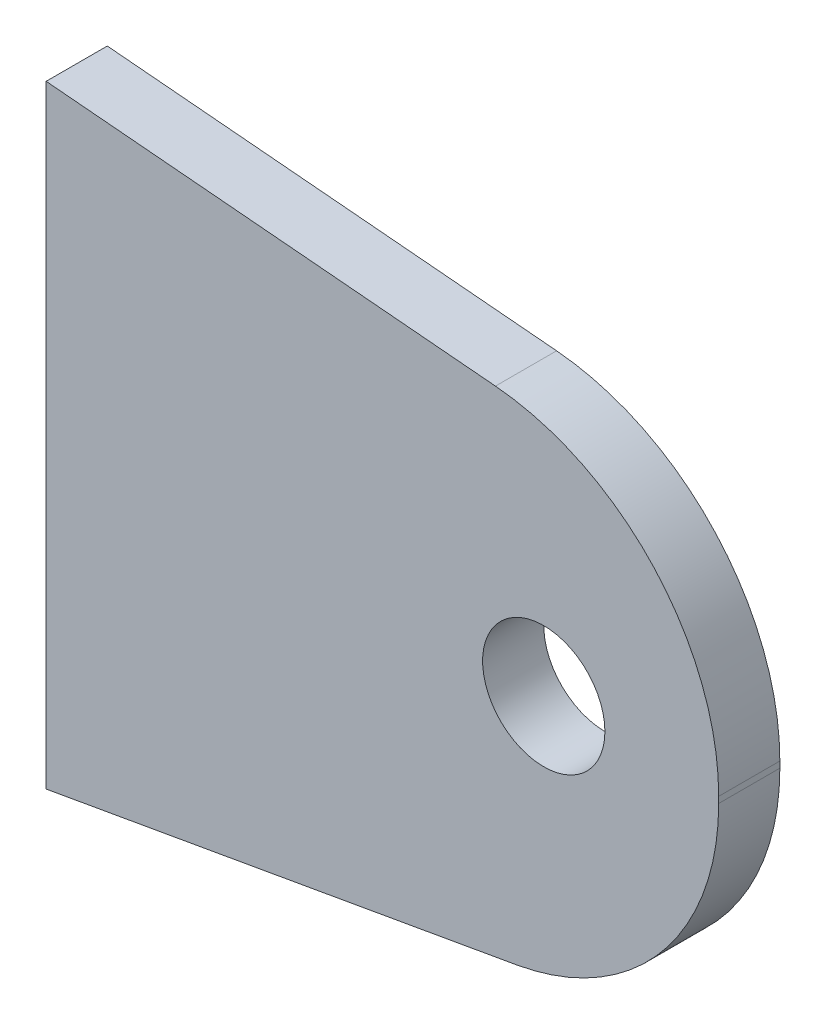
ISO-10303-21;
HEADER;
FILE_DESCRIPTION(('STEP AP214'),'2;1');
FILE_NAME('part.step','',(''),(''),'','','');
FILE_SCHEMA(('AUTOMOTIVE_DESIGN { 1 0 10303 214 1 1 1 1 }'));
ENDSEC;
DATA;
#1=APPLICATION_CONTEXT('core data for automotive mechanical design processes');
#2=APPLICATION_PROTOCOL_DEFINITION('international standard','automotive_design',2000,#1);
#3=PRODUCT_CONTEXT('',#1,'mechanical');
#4=PRODUCT('Part','Part','',(#3));
#5=PRODUCT_RELATED_PRODUCT_CATEGORY('part','',(#4));
#6=PRODUCT_DEFINITION_FORMATION('','',#4);
#7=PRODUCT_DEFINITION_CONTEXT('part definition',#1,'design');
#8=PRODUCT_DEFINITION('design','',#6,#7);
#9=PRODUCT_DEFINITION_SHAPE('','',#8);
#10=(LENGTH_UNIT() NAMED_UNIT(*) SI_UNIT(.MILLI.,.METRE.));
#11=(NAMED_UNIT(*) PLANE_ANGLE_UNIT() SI_UNIT($,.RADIAN.));
#12=(NAMED_UNIT(*) SI_UNIT($,.STERADIAN.) SOLID_ANGLE_UNIT());
#13=UNCERTAINTY_MEASURE_WITH_UNIT(LENGTH_MEASURE(1.E-05),#10,'distance_accuracy_value','');
#14=(GEOMETRIC_REPRESENTATION_CONTEXT(3) GLOBAL_UNCERTAINTY_ASSIGNED_CONTEXT((#13)) GLOBAL_UNIT_ASSIGNED_CONTEXT((#10,
#11,#12)) REPRESENTATION_CONTEXT('',''));
#15=CARTESIAN_POINT('',(0.,0.,0.));
#16=DIRECTION('',(0.,0.,1.));
#17=DIRECTION('',(1.,0.,0.));
#18=AXIS2_PLACEMENT_3D('',#15,#16,#17);
#19=CARTESIAN_POINT('',(-29.2805766428955,20.7610868287197,3.175));
#20=DIRECTION('',(1.,0.,0.));
#21=DIRECTION('',(0.,0.,-1.));
#22=AXIS2_PLACEMENT_3D('',#19,#20,#21);
#23=PLANE('',#22);
#24=DIRECTION('',(0.,-1.,0.));
#25=VECTOR('',#24,1.);
#26=CARTESIAN_POINT('',(-29.2805766428955,20.7610868287197,0.));
#27=LINE('',#26,#25);
#28=CARTESIAN_POINT('',(-29.2805766428955,20.7610868287197,0.));
#29=VERTEX_POINT('',#28);
#30=CARTESIAN_POINT('',(-29.2805766428955,-11.0681611712803,0.));
#31=VERTEX_POINT('',#30);
#32=EDGE_CURVE('E104',#29,#31,#27,.T.);
#33=ORIENTED_EDGE('',*,*,#32,.T.);
#34=DIRECTION('',(0.,0.,-1.));
#35=VECTOR('',#34,1.);
#36=CARTESIAN_POINT('',(-29.2805766428955,-11.0681611712803,3.175));
#37=LINE('',#36,#35);
#38=CARTESIAN_POINT('',(-29.2805766428955,-11.0681611712803,3.175));
#39=VERTEX_POINT('',#38);
#40=EDGE_CURVE('E92',#39,#31,#37,.T.);
#41=ORIENTED_EDGE('',*,*,#40,.F.);
#42=DIRECTION('',(0.,-1.,0.));
#43=VECTOR('',#42,1.);
#44=CARTESIAN_POINT('',(-29.2805766428955,20.7610868287197,3.175));
#45=LINE('',#44,#43);
#46=CARTESIAN_POINT('',(-29.2805766428955,20.7610868287197,3.175));
#47=VERTEX_POINT('',#46);
#48=EDGE_CURVE('E102',#47,#39,#45,.T.);
#49=ORIENTED_EDGE('',*,*,#48,.F.);
#50=DIRECTION('',(0.,0.,-1.));
#51=VECTOR('',#50,1.);
#52=CARTESIAN_POINT('',(-29.2805766428955,20.7610868287197,3.175));
#53=LINE('',#52,#51);
#54=EDGE_CURVE('E112',#47,#29,#53,.T.);
#55=ORIENTED_EDGE('',*,*,#54,.T.);
#56=EDGE_LOOP('',(#33,#41,#49,#55));
#57=FACE_BOUND('',#56,.T.);
#58=ADVANCED_FACE('F39',(#57),#23,.F.);
#59=CARTESIAN_POINT('',(0.,0.,3.175));
#60=DIRECTION('',(0.,0.,1.));
#61=DIRECTION('',(1.,0.,0.));
#62=AXIS2_PLACEMENT_3D('',#59,#60,#61);
#63=PLANE('',#62);
#64=DIRECTION('',(0.,-1.,0.));
#65=VECTOR('',#64,1.);
#66=CARTESIAN_POINT('',(5.6444233571045,0.,3.175));
#67=LINE('',#66,#65);
#68=CARTESIAN_POINT('',(5.6444233571045,6.06813934505543,3.175));
#69=VERTEX_POINT('',#68);
#70=CARTESIAN_POINT('',(5.6444233571045,5.74662394591438,3.175));
#71=VERTEX_POINT('',#70);
#72=EDGE_CURVE('E95',#69,#71,#67,.T.);
#73=ORIENTED_EDGE('',*,*,#72,.F.);
#74=CARTESIAN_POINT('',(-7.05557664289549,6.06813934505543,3.175));
#75=DIRECTION('',(0.,0.,1.));
#76=DIRECTION('',(1.,0.,0.));
#77=AXIS2_PLACEMENT_3D('',#74,#75,#76);
#78=CIRCLE('',#77,12.7);
#79=CARTESIAN_POINT('',(-5.94869871000019,18.7198120108206,3.175));
#80=VERTEX_POINT('',#79);
#81=EDGE_CURVE('E47',#69,#80,#78,.T.);
#82=ORIENTED_EDGE('',*,*,#81,.T.);
#83=DIRECTION('',(-0.996194698091745,0.0871557427476617,0.));
#84=VECTOR('',#83,1.);
#85=CARTESIAN_POINT('',(1.58014357094418,18.0611236617633,3.175));
#86=LINE('',#85,#84);
#87=EDGE_CURVE('E106',#80,#47,#86,.T.);
#88=ORIENTED_EDGE('',*,*,#87,.T.);
#89=ORIENTED_EDGE('',*,*,#48,.T.);
#90=DIRECTION('',(0.984807753012208,0.173648177666934,0.));
#91=VECTOR('',#90,1.);
#92=CARTESIAN_POINT('',(1.00984961547126,-5.72714176476997,3.175));
#93=LINE('',#92,#91);
#94=CARTESIAN_POINT('',(-4.85024478652543,-6.76043451734065,3.175));
#95=VERTEX_POINT('',#94);
#96=EDGE_CURVE('E89',#39,#95,#93,.T.);
#97=ORIENTED_EDGE('',*,*,#96,.T.);
#98=CARTESIAN_POINT('',(-7.05557664289549,5.74662394591439,3.175));
#99=DIRECTION('',(0.,0.,1.));
#100=DIRECTION('',(1.,0.,0.));
#101=AXIS2_PLACEMENT_3D('',#98,#99,#100);
#102=CIRCLE('',#101,12.7);
#103=EDGE_CURVE('E59',#95,#71,#102,.T.);
#104=ORIENTED_EDGE('',*,*,#103,.T.);
#105=EDGE_LOOP('',(#73,#82,#88,#89,#97,#104));
#106=FACE_BOUND('',#105,.T.);
#107=CARTESIAN_POINT('',(-3.43988664289549,6.02883282871969,3.175));
#108=DIRECTION('',(0.,0.,1.));
#109=DIRECTION('',(1.,0.,0.));
#110=AXIS2_PLACEMENT_3D('',#107,#108,#109);
#111=CIRCLE('',#110,3.17499999999999);
#112=CARTESIAN_POINT('',(-0.264886642895501,6.02883282871969,3.175));
#113=VERTEX_POINT('',#112);
#114=EDGE_CURVE('E105',#113,#113,#111,.T.);
#115=ORIENTED_EDGE('',*,*,#114,.F.);
#116=EDGE_LOOP('',(#115));
#117=FACE_BOUND('',#116,.T.);
#118=ADVANCED_FACE('F108',(#106,#117),#63,.T.);
#119=CARTESIAN_POINT('',(0.,0.,0.));
#120=DIRECTION('',(0.,0.,1.));
#121=DIRECTION('',(1.,0.,0.));
#122=AXIS2_PLACEMENT_3D('',#119,#120,#121);
#123=PLANE('',#122);
#124=CARTESIAN_POINT('',(-3.43988664289549,6.02883282871969,0.));
#125=DIRECTION('',(0.,0.,1.));
#126=DIRECTION('',(1.,0.,0.));
#127=AXIS2_PLACEMENT_3D('',#124,#125,#126);
#128=CIRCLE('',#127,3.17499999999999);
#129=CARTESIAN_POINT('',(-0.264886642895497,6.02883282871969,0.));
#130=VERTEX_POINT('',#129);
#131=EDGE_CURVE('E116',#130,#130,#128,.T.);
#132=ORIENTED_EDGE('',*,*,#131,.T.);
#133=EDGE_LOOP('',(#132));
#134=FACE_BOUND('',#133,.T.);
#135=DIRECTION('',(-0.996194698091745,0.0871557427476617,0.));
#136=VECTOR('',#135,1.);
#137=CARTESIAN_POINT('',(1.58014357094418,18.0611236617633,0.));
#138=LINE('',#137,#136);
#139=CARTESIAN_POINT('',(-5.94869871000019,18.7198120108206,0.));
#140=VERTEX_POINT('',#139);
#141=EDGE_CURVE('E96',#140,#29,#138,.T.);
#142=ORIENTED_EDGE('',*,*,#141,.F.);
#143=CARTESIAN_POINT('',(-7.05557664289549,6.06813934505543,0.));
#144=DIRECTION('',(0.,0.,1.));
#145=DIRECTION('',(1.,0.,0.));
#146=AXIS2_PLACEMENT_3D('',#143,#144,#145);
#147=CIRCLE('',#146,12.7);
#148=CARTESIAN_POINT('',(5.6444233571045,6.06813934505543,0.));
#149=VERTEX_POINT('',#148);
#150=EDGE_CURVE('E125',#140,#149,#147,.F.);
#151=ORIENTED_EDGE('',*,*,#150,.T.);
#152=DIRECTION('',(0.,-1.,0.));
#153=VECTOR('',#152,1.);
#154=CARTESIAN_POINT('',(5.6444233571045,0.,0.));
#155=LINE('',#154,#153);
#156=CARTESIAN_POINT('',(5.6444233571045,5.74662394591438,0.));
#157=VERTEX_POINT('',#156);
#158=EDGE_CURVE('E145',#149,#157,#155,.T.);
#159=ORIENTED_EDGE('',*,*,#158,.T.);
#160=CARTESIAN_POINT('',(-7.05557664289549,5.74662394591439,0.));
#161=DIRECTION('',(0.,0.,1.));
#162=DIRECTION('',(1.,0.,0.));
#163=AXIS2_PLACEMENT_3D('',#160,#161,#162);
#164=CIRCLE('',#163,12.7);
#165=CARTESIAN_POINT('',(-4.85024478652543,-6.76043451734065,0.));
#166=VERTEX_POINT('',#165);
#167=EDGE_CURVE('E123',#157,#166,#164,.F.);
#168=ORIENTED_EDGE('',*,*,#167,.T.);
#169=DIRECTION('',(0.984807753012208,0.173648177666934,0.));
#170=VECTOR('',#169,1.);
#171=CARTESIAN_POINT('',(1.00984961547126,-5.72714176476997,0.));
#172=LINE('',#171,#170);
#173=EDGE_CURVE('E149',#31,#166,#172,.T.);
#174=ORIENTED_EDGE('',*,*,#173,.F.);
#175=ORIENTED_EDGE('',*,*,#32,.F.);
#176=EDGE_LOOP('',(#142,#151,#159,#168,#174,#175));
#177=FACE_BOUND('',#176,.T.);
#178=ADVANCED_FACE('F144',(#134,#177),#123,.F.);
#179=CARTESIAN_POINT('',(-3.43988664289549,6.02883282871969,3.175));
#180=DIRECTION('',(0.,0.,1.));
#181=DIRECTION('',(1.,0.,0.));
#182=AXIS2_PLACEMENT_3D('',#179,#180,#181);
#183=CYLINDRICAL_SURFACE('',#182,3.17499999999999);
#184=ORIENTED_EDGE('',*,*,#114,.T.);
#185=EDGE_LOOP('',(#184));
#186=FACE_BOUND('',#185,.T.);
#187=ORIENTED_EDGE('',*,*,#131,.F.);
#188=EDGE_LOOP('',(#187));
#189=FACE_BOUND('',#188,.T.);
#190=ADVANCED_FACE('F160',(#186,#189),#183,.F.);
#191=CARTESIAN_POINT('',(1.58014357094418,18.0611236617633,3.175));
#192=DIRECTION('',(-0.0871557427476617,-0.996194698091745,0.));
#193=DIRECTION('',(0.996194698091745,-0.0871557427476617,0.));
#194=AXIS2_PLACEMENT_3D('',#191,#192,#193);
#195=PLANE('',#194);
#196=ORIENTED_EDGE('',*,*,#87,.F.);
#197=DIRECTION('',(0.,0.,-1.));
#198=VECTOR('',#197,1.);
#199=CARTESIAN_POINT('',(-5.94869871000019,18.7198120108206,0.));
#200=LINE('',#199,#198);
#201=EDGE_CURVE('E114',#80,#140,#200,.T.);
#202=ORIENTED_EDGE('',*,*,#201,.T.);
#203=ORIENTED_EDGE('',*,*,#141,.T.);
#204=ORIENTED_EDGE('',*,*,#54,.F.);
#205=EDGE_LOOP('',(#196,#202,#203,#204));
#206=FACE_BOUND('',#205,.T.);
#207=ADVANCED_FACE('F137',(#206),#195,.F.);
#208=CARTESIAN_POINT('',(5.6444233571045,0.,3.175));
#209=DIRECTION('',(1.,0.,0.));
#210=DIRECTION('',(0.,1.,0.));
#211=AXIS2_PLACEMENT_3D('',#208,#209,#210);
#212=PLANE('',#211);
#213=ORIENTED_EDGE('',*,*,#158,.F.);
#214=DIRECTION('',(0.,0.,-1.));
#215=VECTOR('',#214,1.);
#216=CARTESIAN_POINT('',(5.6444233571045,6.06813934505543,3.175));
#217=LINE('',#216,#215);
#218=EDGE_CURVE('E130',#149,#69,#217,.F.);
#219=ORIENTED_EDGE('',*,*,#218,.T.);
#220=ORIENTED_EDGE('',*,*,#72,.T.);
#221=DIRECTION('',(0.,0.,-1.));
#222=VECTOR('',#221,1.);
#223=CARTESIAN_POINT('',(5.6444233571045,5.74662394591438,0.));
#224=LINE('',#223,#222);
#225=EDGE_CURVE('E127',#71,#157,#224,.T.);
#226=ORIENTED_EDGE('',*,*,#225,.T.);
#227=EDGE_LOOP('',(#213,#219,#220,#226));
#228=FACE_BOUND('',#227,.T.);
#229=ADVANCED_FACE('F147',(#228),#212,.T.);
#230=CARTESIAN_POINT('',(1.00984961547126,-5.72714176476997,3.175));
#231=DIRECTION('',(-0.173648177666934,0.984807753012207,0.));
#232=DIRECTION('',(-0.984807753012208,-0.173648177666934,0.));
#233=AXIS2_PLACEMENT_3D('',#230,#231,#232);
#234=PLANE('',#233);
#235=ORIENTED_EDGE('',*,*,#173,.T.);
#236=DIRECTION('',(0.,0.,-1.));
#237=VECTOR('',#236,1.);
#238=CARTESIAN_POINT('',(-4.85024478652543,-6.76043451734065,3.175));
#239=LINE('',#238,#237);
#240=EDGE_CURVE('E11',#166,#95,#239,.F.);
#241=ORIENTED_EDGE('',*,*,#240,.T.);
#242=ORIENTED_EDGE('',*,*,#96,.F.);
#243=ORIENTED_EDGE('',*,*,#40,.T.);
#244=EDGE_LOOP('',(#235,#241,#242,#243));
#245=FACE_BOUND('',#244,.T.);
#246=ADVANCED_FACE('F91',(#245),#234,.F.);
#247=CARTESIAN_POINT('',(-7.05557664289549,6.06813934505543,3.175));
#248=DIRECTION('',(0.,0.,1.));
#249=DIRECTION('',(1.,0.,0.));
#250=AXIS2_PLACEMENT_3D('',#247,#248,#249);
#251=CYLINDRICAL_SURFACE('',#250,12.7);
#252=ORIENTED_EDGE('',*,*,#81,.F.);
#253=ORIENTED_EDGE('',*,*,#218,.F.);
#254=ORIENTED_EDGE('',*,*,#150,.F.);
#255=ORIENTED_EDGE('',*,*,#201,.F.);
#256=EDGE_LOOP('',(#252,#253,#254,#255));
#257=FACE_BOUND('',#256,.T.);
#258=ADVANCED_FACE('F140',(#257),#251,.T.);
#259=CARTESIAN_POINT('',(-7.05557664289549,5.74662394591439,3.175));
#260=DIRECTION('',(0.,0.,1.));
#261=DIRECTION('',(1.,0.,0.));
#262=AXIS2_PLACEMENT_3D('',#259,#260,#261);
#263=CYLINDRICAL_SURFACE('',#262,12.7);
#264=ORIENTED_EDGE('',*,*,#103,.F.);
#265=ORIENTED_EDGE('',*,*,#240,.F.);
#266=ORIENTED_EDGE('',*,*,#167,.F.);
#267=ORIENTED_EDGE('',*,*,#225,.F.);
#268=EDGE_LOOP('',(#264,#265,#266,#267));
#269=FACE_BOUND('',#268,.T.);
#270=ADVANCED_FACE('F41',(#269),#263,.T.);
#271=CLOSED_SHELL('',(#58,#118,#178,#190,#207,#229,#246,#258,#270));
#272=MANIFOLD_SOLID_BREP('B2',#271);
#273=ADVANCED_BREP_SHAPE_REPRESENTATION('',(#18,#272),#14);
#274=SHAPE_DEFINITION_REPRESENTATION(#9,#273);
ENDSEC;
END-ISO-10303-21;
